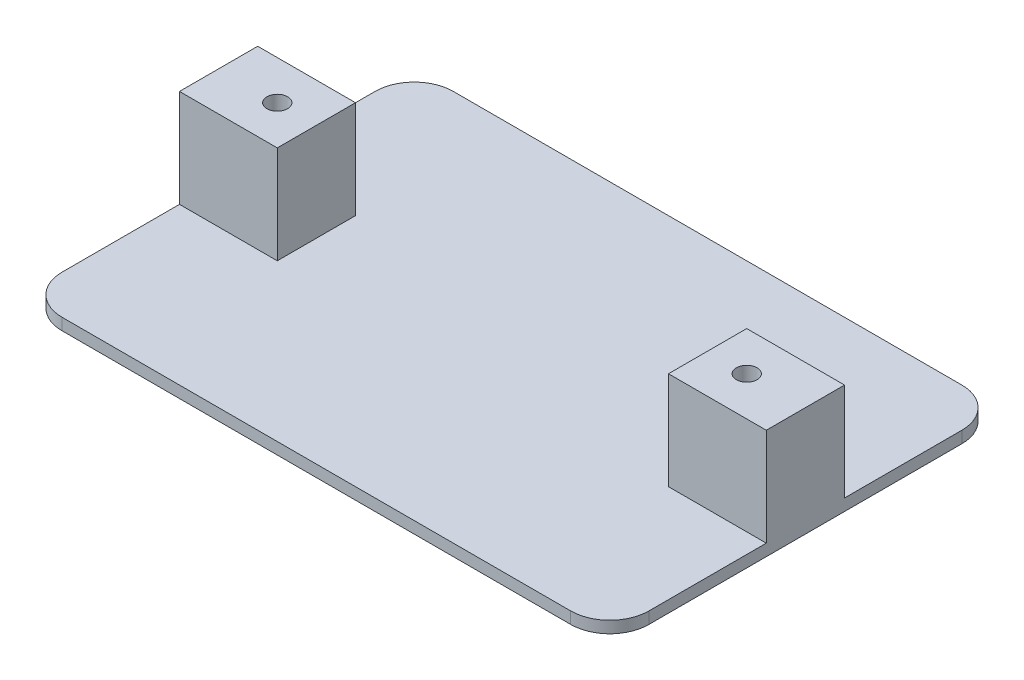
ISO-10303-21;
HEADER;
FILE_DESCRIPTION(('STEP AP214'),'2;1');
FILE_NAME('part.step','',(''),(''),'','','');
FILE_SCHEMA(('AUTOMOTIVE_DESIGN { 1 0 10303 214 1 1 1 1 }'));
ENDSEC;
DATA;
#1=APPLICATION_CONTEXT('core data for automotive mechanical design processes');
#2=APPLICATION_PROTOCOL_DEFINITION('international standard','automotive_design',2000,#1);
#3=PRODUCT_CONTEXT('',#1,'mechanical');
#4=PRODUCT('Part','Part','',(#3));
#5=PRODUCT_RELATED_PRODUCT_CATEGORY('part','',(#4));
#6=PRODUCT_DEFINITION_FORMATION('','',#4);
#7=PRODUCT_DEFINITION_CONTEXT('part definition',#1,'design');
#8=PRODUCT_DEFINITION('design','',#6,#7);
#9=PRODUCT_DEFINITION_SHAPE('','',#8);
#10=(LENGTH_UNIT() NAMED_UNIT(*) SI_UNIT(.MILLI.,.METRE.));
#11=(NAMED_UNIT(*) PLANE_ANGLE_UNIT() SI_UNIT($,.RADIAN.));
#12=(NAMED_UNIT(*) SI_UNIT($,.STERADIAN.) SOLID_ANGLE_UNIT());
#13=UNCERTAINTY_MEASURE_WITH_UNIT(LENGTH_MEASURE(1.E-05),#10,'distance_accuracy_value','');
#14=(GEOMETRIC_REPRESENTATION_CONTEXT(3) GLOBAL_UNCERTAINTY_ASSIGNED_CONTEXT((#13)) GLOBAL_UNIT_ASSIGNED_CONTEXT((#10,
#11,#12)) REPRESENTATION_CONTEXT('',''));
#15=CARTESIAN_POINT('',(0.,0.,0.));
#16=DIRECTION('',(0.,0.,1.));
#17=DIRECTION('',(1.,0.,0.));
#18=AXIS2_PLACEMENT_3D('',#15,#16,#17);
#19=CARTESIAN_POINT('',(0.,3.,0.));
#20=DIRECTION('',(0.,-1.,0.));
#21=DIRECTION('',(0.,0.,-1.));
#22=AXIS2_PLACEMENT_3D('',#19,#20,#21);
#23=PLANE('',#22);
#24=CARTESIAN_POINT('',(60.,3.,0.));
#25=DIRECTION('',(0.,1.,0.));
#26=DIRECTION('',(0.,0.,1.));
#27=AXIS2_PLACEMENT_3D('',#24,#25,#26);
#28=CIRCLE('',#27,2.6);
#29=CARTESIAN_POINT('',(60.,3.,2.6));
#30=VERTEX_POINT('',#29);
#31=EDGE_CURVE('E257',#30,#30,#28,.T.);
#32=ORIENTED_EDGE('',*,*,#31,.F.);
#33=EDGE_LOOP('',(#32));
#34=FACE_BOUND('',#33,.T.);
#35=CARTESIAN_POINT('',(60.,3.,0.));
#36=DIRECTION('',(0.,1.,0.));
#37=DIRECTION('',(0.,0.,1.));
#38=AXIS2_PLACEMENT_3D('',#35,#36,#37);
#39=CIRCLE('',#38,2.65);
#40=CARTESIAN_POINT('',(60.,3.,2.65000000000001));
#41=VERTEX_POINT('',#40);
#42=EDGE_CURVE('E624',#41,#41,#39,.T.);
#43=ORIENTED_EDGE('',*,*,#42,.T.);
#44=EDGE_LOOP('',(#43));
#45=FACE_BOUND('',#44,.T.);
#46=ADVANCED_FACE('F38',(#34,#45),#23,.F.);
#47=CARTESIAN_POINT('',(-60.,3.,0.));
#48=DIRECTION('',(0.,1.,0.));
#49=DIRECTION('',(0.,0.,1.));
#50=AXIS2_PLACEMENT_3D('',#47,#48,#49);
#51=CIRCLE('',#50,2.6);
#52=CARTESIAN_POINT('',(-60.,3.,2.6));
#53=VERTEX_POINT('',#52);
#54=EDGE_CURVE('E265',#53,#53,#51,.T.);
#55=ORIENTED_EDGE('',*,*,#54,.F.);
#56=EDGE_LOOP('',(#55));
#57=FACE_BOUND('',#56,.T.);
#58=CARTESIAN_POINT('',(-60.,3.,0.));
#59=DIRECTION('',(0.,1.,0.));
#60=DIRECTION('',(0.,0.,1.));
#61=AXIS2_PLACEMENT_3D('',#58,#59,#60);
#62=CIRCLE('',#61,2.65);
#63=CARTESIAN_POINT('',(-60.,3.,2.65));
#64=VERTEX_POINT('',#63);
#65=EDGE_CURVE('E175',#64,#64,#62,.T.);
#66=ORIENTED_EDGE('',*,*,#65,.T.);
#67=EDGE_LOOP('',(#66));
#68=FACE_BOUND('',#67,.T.);
#69=ADVANCED_FACE('F414',(#57,#68),#23,.F.);
#70=DIRECTION('',(-1.,0.,0.));
#71=VECTOR('',#70,1.);
#72=CARTESIAN_POINT('',(-75.,3.,-50.));
#73=LINE('',#72,#71);
#74=CARTESIAN_POINT('',(65.,3.,-50.));
#75=VERTEX_POINT('',#74);
#76=CARTESIAN_POINT('',(-65.,3.,-50.));
#77=VERTEX_POINT('',#76);
#78=EDGE_CURVE('E276',#75,#77,#73,.T.);
#79=ORIENTED_EDGE('',*,*,#78,.T.);
#80=CARTESIAN_POINT('',(-65.,3.,-40.));
#81=DIRECTION('',(0.,-1.,0.));
#82=DIRECTION('',(0.,0.,-1.));
#83=AXIS2_PLACEMENT_3D('',#80,#81,#82);
#84=CIRCLE('',#83,10.);
#85=CARTESIAN_POINT('',(-75.,3.,-40.));
#86=VERTEX_POINT('',#85);
#87=EDGE_CURVE('E336',#77,#86,#84,.F.);
#88=ORIENTED_EDGE('',*,*,#87,.T.);
#89=DIRECTION('',(0.,0.,1.));
#90=VECTOR('',#89,1.);
#91=CARTESIAN_POINT('',(-75.,3.,50.));
#92=LINE('',#91,#90);
#93=CARTESIAN_POINT('',(-75.,3.,-10.));
#94=VERTEX_POINT('',#93);
#95=EDGE_CURVE('E282',#86,#94,#92,.T.);
#96=ORIENTED_EDGE('',*,*,#95,.T.);
#97=DIRECTION('',(-1.,0.,0.));
#98=VECTOR('',#97,1.);
#99=CARTESIAN_POINT('',(-70.,3.,-10.));
#100=LINE('',#99,#98);
#101=CARTESIAN_POINT('',(-50.,3.,-10.));
#102=VERTEX_POINT('',#101);
#103=EDGE_CURVE('E234',#102,#94,#100,.T.);
#104=ORIENTED_EDGE('',*,*,#103,.F.);
#105=DIRECTION('',(0.,0.,-1.));
#106=VECTOR('',#105,1.);
#107=CARTESIAN_POINT('',(-50.,3.,10.));
#108=LINE('',#107,#106);
#109=CARTESIAN_POINT('',(-50.,3.,10.));
#110=VERTEX_POINT('',#109);
#111=EDGE_CURVE('E212',#110,#102,#108,.T.);
#112=ORIENTED_EDGE('',*,*,#111,.F.);
#113=DIRECTION('',(1.,0.,0.));
#114=VECTOR('',#113,1.);
#115=CARTESIAN_POINT('',(-70.,3.,10.));
#116=LINE('',#115,#114);
#117=CARTESIAN_POINT('',(-75.,3.,9.99999999999999));
#118=VERTEX_POINT('',#117);
#119=EDGE_CURVE('E221',#118,#110,#116,.T.);
#120=ORIENTED_EDGE('',*,*,#119,.F.);
#121=CARTESIAN_POINT('',(-75.,3.,40.));
#122=VERTEX_POINT('',#121);
#123=EDGE_CURVE('E281',#118,#122,#92,.T.);
#124=ORIENTED_EDGE('',*,*,#123,.T.);
#125=CARTESIAN_POINT('',(-65.,3.,40.));
#126=DIRECTION('',(0.,-1.,0.));
#127=DIRECTION('',(0.,0.,-1.));
#128=AXIS2_PLACEMENT_3D('',#125,#126,#127);
#129=CIRCLE('',#128,10.);
#130=CARTESIAN_POINT('',(-65.,3.,50.));
#131=VERTEX_POINT('',#130);
#132=EDGE_CURVE('E328',#122,#131,#129,.F.);
#133=ORIENTED_EDGE('',*,*,#132,.T.);
#134=DIRECTION('',(1.,0.,0.));
#135=VECTOR('',#134,1.);
#136=CARTESIAN_POINT('',(-75.,3.,50.));
#137=LINE('',#136,#135);
#138=CARTESIAN_POINT('',(65.,3.,50.));
#139=VERTEX_POINT('',#138);
#140=EDGE_CURVE('E285',#131,#139,#137,.T.);
#141=ORIENTED_EDGE('',*,*,#140,.T.);
#142=CARTESIAN_POINT('',(65.,3.,40.));
#143=DIRECTION('',(0.,-1.,0.));
#144=DIRECTION('',(0.,0.,-1.));
#145=AXIS2_PLACEMENT_3D('',#142,#143,#144);
#146=CIRCLE('',#145,10.);
#147=CARTESIAN_POINT('',(75.,3.,40.));
#148=VERTEX_POINT('',#147);
#149=EDGE_CURVE('E54',#139,#148,#146,.F.);
#150=ORIENTED_EDGE('',*,*,#149,.T.);
#151=DIRECTION('',(0.,0.,-1.));
#152=VECTOR('',#151,1.);
#153=CARTESIAN_POINT('',(75.,3.,50.));
#154=LINE('',#153,#152);
#155=CARTESIAN_POINT('',(75.,3.,10.0023947766886));
#156=VERTEX_POINT('',#155);
#157=EDGE_CURVE('E273',#148,#156,#154,.T.);
#158=ORIENTED_EDGE('',*,*,#157,.T.);
#159=DIRECTION('',(1.,0.,0.));
#160=VECTOR('',#159,1.);
#161=CARTESIAN_POINT('',(70.0023947766885,3.,10.0023947766886));
#162=LINE('',#161,#160);
#163=CARTESIAN_POINT('',(49.9976052233114,3.,10.0023947766885));
#164=VERTEX_POINT('',#163);
#165=EDGE_CURVE('E164',#164,#156,#162,.T.);
#166=ORIENTED_EDGE('',*,*,#165,.F.);
#167=DIRECTION('',(0.,0.,1.));
#168=VECTOR('',#167,1.);
#169=CARTESIAN_POINT('',(49.9976052233114,3.,10.0023947766886));
#170=LINE('',#169,#168);
#171=CARTESIAN_POINT('',(49.9976052233114,3.,-10.0023947766885));
#172=VERTEX_POINT('',#171);
#173=EDGE_CURVE('E193',#172,#164,#170,.T.);
#174=ORIENTED_EDGE('',*,*,#173,.F.);
#175=DIRECTION('',(-1.,0.,0.));
#176=VECTOR('',#175,1.);
#177=CARTESIAN_POINT('',(49.9976052233114,3.,-10.0023947766885));
#178=LINE('',#177,#176);
#179=CARTESIAN_POINT('',(75.,3.,-10.0023947766885));
#180=VERTEX_POINT('',#179);
#181=EDGE_CURVE('E171',#180,#172,#178,.T.);
#182=ORIENTED_EDGE('',*,*,#181,.F.);
#183=CARTESIAN_POINT('',(75.,3.,-40.));
#184=VERTEX_POINT('',#183);
#185=EDGE_CURVE('E277',#180,#184,#154,.T.);
#186=ORIENTED_EDGE('',*,*,#185,.T.);
#187=CARTESIAN_POINT('',(65.,3.,-40.));
#188=DIRECTION('',(0.,-1.,0.));
#189=DIRECTION('',(0.,0.,-1.));
#190=AXIS2_PLACEMENT_3D('',#187,#188,#189);
#191=CIRCLE('',#190,10.);
#192=EDGE_CURVE('E333',#184,#75,#191,.F.);
#193=ORIENTED_EDGE('',*,*,#192,.T.);
#194=EDGE_LOOP('',(#79,#88,#96,#104,#112,#120,#124,#133,#141,#150,#158,#166,#174,#182,#186,#193));
#195=FACE_BOUND('',#194,.T.);
#196=ADVANCED_FACE('F364',(#195),#23,.F.);
#197=CARTESIAN_POINT('',(0.,0.,0.));
#198=DIRECTION('',(0.,-1.,0.));
#199=DIRECTION('',(0.,0.,-1.));
#200=AXIS2_PLACEMENT_3D('',#197,#198,#199);
#201=PLANE('',#200);
#202=CARTESIAN_POINT('',(-60.,0.,0.));
#203=DIRECTION('',(0.,1.,0.));
#204=DIRECTION('',(0.,0.,1.));
#205=AXIS2_PLACEMENT_3D('',#202,#203,#204);
#206=CIRCLE('',#205,2.6);
#207=CARTESIAN_POINT('',(-60.,0.,2.6));
#208=VERTEX_POINT('',#207);
#209=EDGE_CURVE('E261',#208,#208,#206,.T.);
#210=ORIENTED_EDGE('',*,*,#209,.T.);
#211=EDGE_LOOP('',(#210));
#212=FACE_BOUND('',#211,.T.);
#213=DIRECTION('',(0.,0.,1.));
#214=VECTOR('',#213,1.);
#215=CARTESIAN_POINT('',(-75.,0.,50.));
#216=LINE('',#215,#214);
#217=CARTESIAN_POINT('',(-75.,0.,-40.));
#218=VERTEX_POINT('',#217);
#219=CARTESIAN_POINT('',(-75.,0.,40.));
#220=VERTEX_POINT('',#219);
#221=EDGE_CURVE('E296',#218,#220,#216,.T.);
#222=ORIENTED_EDGE('',*,*,#221,.F.);
#223=CARTESIAN_POINT('',(-65.,0.,-40.));
#224=DIRECTION('',(0.,-1.,0.));
#225=DIRECTION('',(0.,0.,-1.));
#226=AXIS2_PLACEMENT_3D('',#223,#224,#225);
#227=CIRCLE('',#226,10.);
#228=CARTESIAN_POINT('',(-65.,0.,-50.));
#229=VERTEX_POINT('',#228);
#230=EDGE_CURVE('E318',#218,#229,#227,.T.);
#231=ORIENTED_EDGE('',*,*,#230,.T.);
#232=DIRECTION('',(-1.,0.,0.));
#233=VECTOR('',#232,1.);
#234=CARTESIAN_POINT('',(-75.,0.,-50.));
#235=LINE('',#234,#233);
#236=CARTESIAN_POINT('',(65.,0.,-50.));
#237=VERTEX_POINT('',#236);
#238=EDGE_CURVE('E292',#237,#229,#235,.T.);
#239=ORIENTED_EDGE('',*,*,#238,.F.);
#240=CARTESIAN_POINT('',(65.,0.,-40.));
#241=DIRECTION('',(0.,-1.,0.));
#242=DIRECTION('',(0.,0.,-1.));
#243=AXIS2_PLACEMENT_3D('',#240,#241,#242);
#244=CIRCLE('',#243,10.);
#245=CARTESIAN_POINT('',(75.,0.,-40.));
#246=VERTEX_POINT('',#245);
#247=EDGE_CURVE('E315',#237,#246,#244,.T.);
#248=ORIENTED_EDGE('',*,*,#247,.T.);
#249=DIRECTION('',(0.,0.,-1.));
#250=VECTOR('',#249,1.);
#251=CARTESIAN_POINT('',(75.,0.,50.));
#252=LINE('',#251,#250);
#253=CARTESIAN_POINT('',(75.,0.,40.));
#254=VERTEX_POINT('',#253);
#255=EDGE_CURVE('E269',#254,#246,#252,.T.);
#256=ORIENTED_EDGE('',*,*,#255,.F.);
#257=CARTESIAN_POINT('',(65.,0.,40.));
#258=DIRECTION('',(0.,-1.,0.));
#259=DIRECTION('',(0.,0.,-1.));
#260=AXIS2_PLACEMENT_3D('',#257,#258,#259);
#261=CIRCLE('',#260,10.);
#262=CARTESIAN_POINT('',(65.,0.,50.));
#263=VERTEX_POINT('',#262);
#264=EDGE_CURVE('E312',#254,#263,#261,.T.);
#265=ORIENTED_EDGE('',*,*,#264,.T.);
#266=DIRECTION('',(1.,0.,0.));
#267=VECTOR('',#266,1.);
#268=CARTESIAN_POINT('',(-75.,0.,50.));
#269=LINE('',#268,#267);
#270=CARTESIAN_POINT('',(-65.,0.,50.));
#271=VERTEX_POINT('',#270);
#272=EDGE_CURVE('E300',#271,#263,#269,.T.);
#273=ORIENTED_EDGE('',*,*,#272,.F.);
#274=CARTESIAN_POINT('',(-65.,0.,40.));
#275=DIRECTION('',(0.,-1.,0.));
#276=DIRECTION('',(0.,0.,-1.));
#277=AXIS2_PLACEMENT_3D('',#274,#275,#276);
#278=CIRCLE('',#277,10.);
#279=EDGE_CURVE('E309',#271,#220,#278,.T.);
#280=ORIENTED_EDGE('',*,*,#279,.T.);
#281=EDGE_LOOP('',(#222,#231,#239,#248,#256,#265,#273,#280));
#282=FACE_BOUND('',#281,.T.);
#283=CARTESIAN_POINT('',(60.,0.,0.));
#284=DIRECTION('',(0.,1.,0.));
#285=DIRECTION('',(0.,0.,1.));
#286=AXIS2_PLACEMENT_3D('',#283,#284,#285);
#287=CIRCLE('',#286,2.6);
#288=CARTESIAN_POINT('',(60.,0.,2.6));
#289=VERTEX_POINT('',#288);
#290=EDGE_CURVE('E256',#289,#289,#287,.T.);
#291=ORIENTED_EDGE('',*,*,#290,.T.);
#292=EDGE_LOOP('',(#291));
#293=FACE_BOUND('',#292,.T.);
#294=ADVANCED_FACE('F354',(#212,#282,#293),#201,.T.);
#295=CARTESIAN_POINT('',(75.,3.,50.));
#296=DIRECTION('',(-1.,0.,0.));
#297=DIRECTION('',(0.,0.,1.));
#298=AXIS2_PLACEMENT_3D('',#295,#296,#297);
#299=PLANE('',#298);
#300=ORIENTED_EDGE('',*,*,#255,.T.);
#301=DIRECTION('',(0.,-1.,0.));
#302=VECTOR('',#301,1.);
#303=CARTESIAN_POINT('',(75.,3.,-40.));
#304=LINE('',#303,#302);
#305=EDGE_CURVE('E343',#246,#184,#304,.F.);
#306=ORIENTED_EDGE('',*,*,#305,.T.);
#307=ORIENTED_EDGE('',*,*,#185,.F.);
#308=DIRECTION('',(0.,-1.,0.));
#309=VECTOR('',#308,1.);
#310=CARTESIAN_POINT('',(75.,28.,-10.0023947766885));
#311=LINE('',#310,#309);
#312=CARTESIAN_POINT('',(75.,28.,-10.0023947766885));
#313=VERTEX_POINT('',#312);
#314=EDGE_CURVE('E190',#313,#180,#311,.T.);
#315=ORIENTED_EDGE('',*,*,#314,.F.);
#316=DIRECTION('',(0.,0.,-1.));
#317=VECTOR('',#316,1.);
#318=CARTESIAN_POINT('',(75.,28.,-10.0023947766885));
#319=LINE('',#318,#317);
#320=CARTESIAN_POINT('',(75.,28.,10.0023947766886));
#321=VERTEX_POINT('',#320);
#322=EDGE_CURVE('E159',#321,#313,#319,.T.);
#323=ORIENTED_EDGE('',*,*,#322,.F.);
#324=DIRECTION('',(0.,-1.,0.));
#325=VECTOR('',#324,1.);
#326=CARTESIAN_POINT('',(75.,28.,10.0023947766886));
#327=LINE('',#326,#325);
#328=EDGE_CURVE('E202',#321,#156,#327,.T.);
#329=ORIENTED_EDGE('',*,*,#328,.T.);
#330=ORIENTED_EDGE('',*,*,#157,.F.);
#331=DIRECTION('',(0.,-1.,0.));
#332=VECTOR('',#331,1.);
#333=CARTESIAN_POINT('',(75.,3.,40.));
#334=LINE('',#333,#332);
#335=EDGE_CURVE('E339',#148,#254,#334,.T.);
#336=ORIENTED_EDGE('',*,*,#335,.T.);
#337=EDGE_LOOP('',(#300,#306,#307,#315,#323,#329,#330,#336));
#338=FACE_BOUND('',#337,.T.);
#339=ADVANCED_FACE('F361',(#338),#299,.F.);
#340=CARTESIAN_POINT('',(-75.,3.,-50.));
#341=DIRECTION('',(0.,0.,1.));
#342=DIRECTION('',(1.,0.,0.));
#343=AXIS2_PLACEMENT_3D('',#340,#341,#342);
#344=PLANE('',#343);
#345=ORIENTED_EDGE('',*,*,#238,.T.);
#346=DIRECTION('',(0.,-1.,0.));
#347=VECTOR('',#346,1.);
#348=CARTESIAN_POINT('',(-65.,3.,-50.));
#349=LINE('',#348,#347);
#350=EDGE_CURVE('E325',#229,#77,#349,.F.);
#351=ORIENTED_EDGE('',*,*,#350,.T.);
#352=ORIENTED_EDGE('',*,*,#78,.F.);
#353=DIRECTION('',(0.,-1.,0.));
#354=VECTOR('',#353,1.);
#355=CARTESIAN_POINT('',(65.,3.,-50.));
#356=LINE('',#355,#354);
#357=EDGE_CURVE('E321',#75,#237,#356,.T.);
#358=ORIENTED_EDGE('',*,*,#357,.T.);
#359=EDGE_LOOP('',(#345,#351,#352,#358));
#360=FACE_BOUND('',#359,.T.);
#361=ADVANCED_FACE('F383',(#360),#344,.F.);
#362=CARTESIAN_POINT('',(-75.,3.,50.));
#363=DIRECTION('',(1.,0.,0.));
#364=DIRECTION('',(0.,0.,-1.));
#365=AXIS2_PLACEMENT_3D('',#362,#363,#364);
#366=PLANE('',#365);
#367=ORIENTED_EDGE('',*,*,#95,.F.);
#368=DIRECTION('',(0.,-1.,0.));
#369=VECTOR('',#368,1.);
#370=CARTESIAN_POINT('',(-75.,3.,-40.));
#371=LINE('',#370,#369);
#372=EDGE_CURVE('E305',#86,#218,#371,.T.);
#373=ORIENTED_EDGE('',*,*,#372,.T.);
#374=ORIENTED_EDGE('',*,*,#221,.T.);
#375=DIRECTION('',(0.,-1.,0.));
#376=VECTOR('',#375,1.);
#377=CARTESIAN_POINT('',(-75.,3.,40.));
#378=LINE('',#377,#376);
#379=EDGE_CURVE('E288',#220,#122,#378,.F.);
#380=ORIENTED_EDGE('',*,*,#379,.T.);
#381=ORIENTED_EDGE('',*,*,#123,.F.);
#382=DIRECTION('',(0.,-1.,0.));
#383=VECTOR('',#382,1.);
#384=CARTESIAN_POINT('',(-75.,28.,10.));
#385=LINE('',#384,#383);
#386=CARTESIAN_POINT('',(-75.,28.,10.));
#387=VERTEX_POINT('',#386);
#388=EDGE_CURVE('E244',#387,#118,#385,.T.);
#389=ORIENTED_EDGE('',*,*,#388,.F.);
#390=DIRECTION('',(0.,0.,1.));
#391=VECTOR('',#390,1.);
#392=CARTESIAN_POINT('',(-75.,28.,-10.));
#393=LINE('',#392,#391);
#394=CARTESIAN_POINT('',(-75.,28.,-10.));
#395=VERTEX_POINT('',#394);
#396=EDGE_CURVE('E224',#395,#387,#393,.T.);
#397=ORIENTED_EDGE('',*,*,#396,.F.);
#398=DIRECTION('',(0.,-1.,0.));
#399=VECTOR('',#398,1.);
#400=CARTESIAN_POINT('',(-75.,28.,-10.));
#401=LINE('',#400,#399);
#402=EDGE_CURVE('E248',#395,#94,#401,.T.);
#403=ORIENTED_EDGE('',*,*,#402,.T.);
#404=EDGE_LOOP('',(#367,#373,#374,#380,#381,#389,#397,#403));
#405=FACE_BOUND('',#404,.T.);
#406=ADVANCED_FACE('F377',(#405),#366,.F.);
#407=CARTESIAN_POINT('',(-75.,3.,50.));
#408=DIRECTION('',(0.,0.,-1.));
#409=DIRECTION('',(-1.,0.,0.));
#410=AXIS2_PLACEMENT_3D('',#407,#408,#409);
#411=PLANE('',#410);
#412=ORIENTED_EDGE('',*,*,#272,.T.);
#413=DIRECTION('',(0.,-1.,0.));
#414=VECTOR('',#413,1.);
#415=CARTESIAN_POINT('',(65.,3.,50.));
#416=LINE('',#415,#414);
#417=EDGE_CURVE('E11',#263,#139,#416,.F.);
#418=ORIENTED_EDGE('',*,*,#417,.T.);
#419=ORIENTED_EDGE('',*,*,#140,.F.);
#420=DIRECTION('',(0.,-1.,0.));
#421=VECTOR('',#420,1.);
#422=CARTESIAN_POINT('',(-65.,3.,50.));
#423=LINE('',#422,#421);
#424=EDGE_CURVE('E47',#131,#271,#423,.T.);
#425=ORIENTED_EDGE('',*,*,#424,.T.);
#426=EDGE_LOOP('',(#412,#418,#419,#425));
#427=FACE_BOUND('',#426,.T.);
#428=ADVANCED_FACE('F349',(#427),#411,.F.);
#429=CARTESIAN_POINT('',(-60.,3.,0.));
#430=DIRECTION('',(0.,-1.,0.));
#431=DIRECTION('',(0.,0.,-1.));
#432=AXIS2_PLACEMENT_3D('',#429,#430,#431);
#433=CYLINDRICAL_SURFACE('',#432,2.6);
#434=ORIENTED_EDGE('',*,*,#54,.T.);
#435=EDGE_LOOP('',(#434));
#436=FACE_BOUND('',#435,.T.);
#437=ORIENTED_EDGE('',*,*,#209,.F.);
#438=EDGE_LOOP('',(#437));
#439=FACE_BOUND('',#438,.T.);
#440=ADVANCED_FACE('F426',(#436,#439),#433,.F.);
#441=CARTESIAN_POINT('',(60.,3.,0.));
#442=DIRECTION('',(0.,-1.,0.));
#443=DIRECTION('',(0.,0.,-1.));
#444=AXIS2_PLACEMENT_3D('',#441,#442,#443);
#445=CYLINDRICAL_SURFACE('',#444,2.6);
#446=ORIENTED_EDGE('',*,*,#31,.T.);
#447=EDGE_LOOP('',(#446));
#448=FACE_BOUND('',#447,.T.);
#449=ORIENTED_EDGE('',*,*,#290,.F.);
#450=EDGE_LOOP('',(#449));
#451=FACE_BOUND('',#450,.T.);
#452=ADVANCED_FACE('F404',(#448,#451),#445,.F.);
#453=CARTESIAN_POINT('',(0.,28.,0.));
#454=DIRECTION('',(0.,-1.,0.));
#455=DIRECTION('',(0.,0.,-1.));
#456=AXIS2_PLACEMENT_3D('',#453,#454,#455);
#457=PLANE('',#456);
#458=DIRECTION('',(0.,0.,-1.));
#459=VECTOR('',#458,1.);
#460=CARTESIAN_POINT('',(-50.,28.,10.));
#461=LINE('',#460,#459);
#462=CARTESIAN_POINT('',(-50.,28.,10.));
#463=VERTEX_POINT('',#462);
#464=CARTESIAN_POINT('',(-50.,28.,-10.));
#465=VERTEX_POINT('',#464);
#466=EDGE_CURVE('E216',#463,#465,#461,.T.);
#467=ORIENTED_EDGE('',*,*,#466,.T.);
#468=DIRECTION('',(-1.,0.,0.));
#469=VECTOR('',#468,1.);
#470=CARTESIAN_POINT('',(-70.,28.,-10.));
#471=LINE('',#470,#469);
#472=EDGE_CURVE('E220',#465,#395,#471,.T.);
#473=ORIENTED_EDGE('',*,*,#472,.T.);
#474=ORIENTED_EDGE('',*,*,#396,.T.);
#475=DIRECTION('',(1.,0.,0.));
#476=VECTOR('',#475,1.);
#477=CARTESIAN_POINT('',(-70.,28.,10.));
#478=LINE('',#477,#476);
#479=EDGE_CURVE('E227',#387,#463,#478,.T.);
#480=ORIENTED_EDGE('',*,*,#479,.T.);
#481=EDGE_LOOP('',(#467,#473,#474,#480));
#482=FACE_BOUND('',#481,.T.);
#483=CARTESIAN_POINT('',(-60.,28.,0.));
#484=DIRECTION('',(0.,1.,0.));
#485=DIRECTION('',(0.,0.,1.));
#486=AXIS2_PLACEMENT_3D('',#483,#484,#485);
#487=CIRCLE('',#486,2.65);
#488=CARTESIAN_POINT('',(-60.,28.,2.65));
#489=VERTEX_POINT('',#488);
#490=EDGE_CURVE('E208',#489,#489,#487,.T.);
#491=ORIENTED_EDGE('',*,*,#490,.F.);
#492=EDGE_LOOP('',(#491));
#493=FACE_BOUND('',#492,.T.);
#494=ADVANCED_FACE('F401',(#482,#493),#457,.F.);
#495=CARTESIAN_POINT('',(-50.,28.,10.));
#496=DIRECTION('',(-1.,0.,0.));
#497=DIRECTION('',(0.,0.,1.));
#498=AXIS2_PLACEMENT_3D('',#495,#496,#497);
#499=PLANE('',#498);
#500=ORIENTED_EDGE('',*,*,#111,.T.);
#501=DIRECTION('',(0.,-1.,0.));
#502=VECTOR('',#501,1.);
#503=CARTESIAN_POINT('',(-50.,28.,-10.));
#504=LINE('',#503,#502);
#505=EDGE_CURVE('E252',#465,#102,#504,.T.);
#506=ORIENTED_EDGE('',*,*,#505,.F.);
#507=ORIENTED_EDGE('',*,*,#466,.F.);
#508=DIRECTION('',(0.,-1.,0.));
#509=VECTOR('',#508,1.);
#510=CARTESIAN_POINT('',(-50.,28.,10.));
#511=LINE('',#510,#509);
#512=EDGE_CURVE('E230',#463,#110,#511,.T.);
#513=ORIENTED_EDGE('',*,*,#512,.T.);
#514=EDGE_LOOP('',(#500,#506,#507,#513));
#515=FACE_BOUND('',#514,.T.);
#516=ADVANCED_FACE('F399',(#515),#499,.F.);
#517=CARTESIAN_POINT('',(-70.,28.,-10.));
#518=DIRECTION('',(0.,0.,1.));
#519=DIRECTION('',(1.,0.,0.));
#520=AXIS2_PLACEMENT_3D('',#517,#518,#519);
#521=PLANE('',#520);
#522=ORIENTED_EDGE('',*,*,#103,.T.);
#523=ORIENTED_EDGE('',*,*,#402,.F.);
#524=ORIENTED_EDGE('',*,*,#472,.F.);
#525=ORIENTED_EDGE('',*,*,#505,.T.);
#526=EDGE_LOOP('',(#522,#523,#524,#525));
#527=FACE_BOUND('',#526,.T.);
#528=ADVANCED_FACE('F391',(#527),#521,.F.);
#529=CARTESIAN_POINT('',(-70.,28.,10.));
#530=DIRECTION('',(0.,0.,-1.));
#531=DIRECTION('',(-1.,0.,0.));
#532=AXIS2_PLACEMENT_3D('',#529,#530,#531);
#533=PLANE('',#532);
#534=ORIENTED_EDGE('',*,*,#119,.T.);
#535=ORIENTED_EDGE('',*,*,#512,.F.);
#536=ORIENTED_EDGE('',*,*,#479,.F.);
#537=ORIENTED_EDGE('',*,*,#388,.T.);
#538=EDGE_LOOP('',(#534,#535,#536,#537));
#539=FACE_BOUND('',#538,.T.);
#540=ADVANCED_FACE('F396',(#539),#533,.F.);
#541=CARTESIAN_POINT('',(-60.,28.,0.));
#542=DIRECTION('',(0.,-1.,0.));
#543=DIRECTION('',(0.,0.,-1.));
#544=AXIS2_PLACEMENT_3D('',#541,#542,#543);
#545=CYLINDRICAL_SURFACE('',#544,2.65);
#546=ORIENTED_EDGE('',*,*,#490,.T.);
#547=EDGE_LOOP('',(#546));
#548=FACE_BOUND('',#547,.T.);
#549=ORIENTED_EDGE('',*,*,#65,.F.);
#550=EDGE_LOOP('',(#549));
#551=FACE_BOUND('',#550,.T.);
#552=ADVANCED_FACE('F408',(#548,#551),#545,.F.);
#553=CARTESIAN_POINT('',(0.,28.,0.));
#554=DIRECTION('',(0.,-1.,0.));
#555=DIRECTION('',(0.,0.,-1.));
#556=AXIS2_PLACEMENT_3D('',#553,#554,#555);
#557=PLANE('',#556);
#558=DIRECTION('',(-1.,0.,0.));
#559=VECTOR('',#558,1.);
#560=CARTESIAN_POINT('',(70.0023947766885,28.,-10.0023947766885));
#561=LINE('',#560,#559);
#562=CARTESIAN_POINT('',(49.9976052233114,28.,-10.0023947766885));
#563=VERTEX_POINT('',#562);
#564=EDGE_CURVE('E151',#313,#563,#561,.T.);
#565=ORIENTED_EDGE('',*,*,#564,.T.);
#566=DIRECTION('',(0.,0.,1.));
#567=VECTOR('',#566,1.);
#568=CARTESIAN_POINT('',(49.9976052233114,28.,10.0023947766886));
#569=LINE('',#568,#567);
#570=CARTESIAN_POINT('',(49.9976052233114,28.,10.0023947766886));
#571=VERTEX_POINT('',#570);
#572=EDGE_CURVE('E156',#563,#571,#569,.T.);
#573=ORIENTED_EDGE('',*,*,#572,.T.);
#574=DIRECTION('',(1.,0.,0.));
#575=VECTOR('',#574,1.);
#576=CARTESIAN_POINT('',(49.9976052233114,28.,10.0023947766886));
#577=LINE('',#576,#575);
#578=EDGE_CURVE('E182',#571,#321,#577,.T.);
#579=ORIENTED_EDGE('',*,*,#578,.T.);
#580=ORIENTED_EDGE('',*,*,#322,.T.);
#581=EDGE_LOOP('',(#565,#573,#579,#580));
#582=FACE_BOUND('',#581,.T.);
#583=CARTESIAN_POINT('',(60.,28.,0.));
#584=DIRECTION('',(0.,1.,0.));
#585=DIRECTION('',(0.,0.,1.));
#586=AXIS2_PLACEMENT_3D('',#583,#584,#585);
#587=CIRCLE('',#586,2.65);
#588=CARTESIAN_POINT('',(60.,28.,2.65000000000001));
#589=VERTEX_POINT('',#588);
#590=EDGE_CURVE('E194',#589,#589,#587,.T.);
#591=ORIENTED_EDGE('',*,*,#590,.F.);
#592=EDGE_LOOP('',(#591));
#593=FACE_BOUND('',#592,.T.);
#594=ADVANCED_FACE('F153',(#582,#593),#557,.F.);
#595=CARTESIAN_POINT('',(49.9976052233114,28.,-10.0023947766885));
#596=DIRECTION('',(0.,0.,1.));
#597=DIRECTION('',(1.,0.,0.));
#598=AXIS2_PLACEMENT_3D('',#595,#596,#597);
#599=PLANE('',#598);
#600=ORIENTED_EDGE('',*,*,#181,.T.);
#601=DIRECTION('',(0.,-1.,0.));
#602=VECTOR('',#601,1.);
#603=CARTESIAN_POINT('',(49.9976052233114,28.,-10.0023947766885));
#604=LINE('',#603,#602);
#605=EDGE_CURVE('E168',#563,#172,#604,.T.);
#606=ORIENTED_EDGE('',*,*,#605,.F.);
#607=ORIENTED_EDGE('',*,*,#564,.F.);
#608=ORIENTED_EDGE('',*,*,#314,.T.);
#609=EDGE_LOOP('',(#600,#606,#607,#608));
#610=FACE_BOUND('',#609,.T.);
#611=ADVANCED_FACE('F169',(#610),#599,.F.);
#612=CARTESIAN_POINT('',(49.9976052233114,28.,10.0023947766886));
#613=DIRECTION('',(1.,0.,0.));
#614=DIRECTION('',(0.,0.,-1.));
#615=AXIS2_PLACEMENT_3D('',#612,#613,#614);
#616=PLANE('',#615);
#617=ORIENTED_EDGE('',*,*,#173,.T.);
#618=DIRECTION('',(0.,-1.,0.));
#619=VECTOR('',#618,1.);
#620=CARTESIAN_POINT('',(49.9976052233114,28.,10.0023947766886));
#621=LINE('',#620,#619);
#622=EDGE_CURVE('E176',#571,#164,#621,.T.);
#623=ORIENTED_EDGE('',*,*,#622,.F.);
#624=ORIENTED_EDGE('',*,*,#572,.F.);
#625=ORIENTED_EDGE('',*,*,#605,.T.);
#626=EDGE_LOOP('',(#617,#623,#624,#625));
#627=FACE_BOUND('',#626,.T.);
#628=ADVANCED_FACE('F178',(#627),#616,.F.);
#629=CARTESIAN_POINT('',(70.0023947766885,28.,10.0023947766886));
#630=DIRECTION('',(0.,0.,-1.));
#631=DIRECTION('',(-1.,0.,0.));
#632=AXIS2_PLACEMENT_3D('',#629,#630,#631);
#633=PLANE('',#632);
#634=ORIENTED_EDGE('',*,*,#165,.T.);
#635=ORIENTED_EDGE('',*,*,#328,.F.);
#636=ORIENTED_EDGE('',*,*,#578,.F.);
#637=ORIENTED_EDGE('',*,*,#622,.T.);
#638=EDGE_LOOP('',(#634,#635,#636,#637));
#639=FACE_BOUND('',#638,.T.);
#640=ADVANCED_FACE('F366',(#639),#633,.F.);
#641=CARTESIAN_POINT('',(60.,28.,0.));
#642=DIRECTION('',(0.,-1.,0.));
#643=DIRECTION('',(0.,0.,-1.));
#644=AXIS2_PLACEMENT_3D('',#641,#642,#643);
#645=CYLINDRICAL_SURFACE('',#644,2.65);
#646=ORIENTED_EDGE('',*,*,#590,.T.);
#647=EDGE_LOOP('',(#646));
#648=FACE_BOUND('',#647,.T.);
#649=ORIENTED_EDGE('',*,*,#42,.F.);
#650=EDGE_LOOP('',(#649));
#651=FACE_BOUND('',#650,.T.);
#652=ADVANCED_FACE('F442',(#648,#651),#645,.F.);
#653=CARTESIAN_POINT('',(-65.,3.,-40.));
#654=DIRECTION('',(0.,-1.,0.));
#655=DIRECTION('',(0.,0.,-1.));
#656=AXIS2_PLACEMENT_3D('',#653,#654,#655);
#657=CYLINDRICAL_SURFACE('',#656,10.);
#658=ORIENTED_EDGE('',*,*,#87,.F.);
#659=ORIENTED_EDGE('',*,*,#350,.F.);
#660=ORIENTED_EDGE('',*,*,#230,.F.);
#661=ORIENTED_EDGE('',*,*,#372,.F.);
#662=EDGE_LOOP('',(#658,#659,#660,#661));
#663=FACE_BOUND('',#662,.T.);
#664=ADVANCED_FACE('F387',(#663),#657,.T.);
#665=CARTESIAN_POINT('',(65.,3.,-40.));
#666=DIRECTION('',(0.,-1.,0.));
#667=DIRECTION('',(0.,0.,-1.));
#668=AXIS2_PLACEMENT_3D('',#665,#666,#667);
#669=CYLINDRICAL_SURFACE('',#668,10.);
#670=ORIENTED_EDGE('',*,*,#192,.F.);
#671=ORIENTED_EDGE('',*,*,#305,.F.);
#672=ORIENTED_EDGE('',*,*,#247,.F.);
#673=ORIENTED_EDGE('',*,*,#357,.F.);
#674=EDGE_LOOP('',(#670,#671,#672,#673));
#675=FACE_BOUND('',#674,.T.);
#676=ADVANCED_FACE('F441',(#675),#669,.T.);
#677=CARTESIAN_POINT('',(65.,3.,40.));
#678=DIRECTION('',(0.,-1.,0.));
#679=DIRECTION('',(0.,0.,-1.));
#680=AXIS2_PLACEMENT_3D('',#677,#678,#679);
#681=CYLINDRICAL_SURFACE('',#680,10.);
#682=ORIENTED_EDGE('',*,*,#149,.F.);
#683=ORIENTED_EDGE('',*,*,#417,.F.);
#684=ORIENTED_EDGE('',*,*,#264,.F.);
#685=ORIENTED_EDGE('',*,*,#335,.F.);
#686=EDGE_LOOP('',(#682,#683,#684,#685));
#687=FACE_BOUND('',#686,.T.);
#688=ADVANCED_FACE('F359',(#687),#681,.T.);
#689=CARTESIAN_POINT('',(-65.,3.,40.));
#690=DIRECTION('',(0.,-1.,0.));
#691=DIRECTION('',(0.,0.,-1.));
#692=AXIS2_PLACEMENT_3D('',#689,#690,#691);
#693=CYLINDRICAL_SURFACE('',#692,10.);
#694=ORIENTED_EDGE('',*,*,#132,.F.);
#695=ORIENTED_EDGE('',*,*,#379,.F.);
#696=ORIENTED_EDGE('',*,*,#279,.F.);
#697=ORIENTED_EDGE('',*,*,#424,.F.);
#698=EDGE_LOOP('',(#694,#695,#696,#697));
#699=FACE_BOUND('',#698,.T.);
#700=ADVANCED_FACE('F40',(#699),#693,.T.);
#701=CLOSED_SHELL('',(#46,#69,#196,#294,#339,#361,#406,#428,#440,#452,#494,#516,#528,#540,#552,
#594,#611,#628,#640,#652,#664,#676,#688,#700));
#702=MANIFOLD_SOLID_BREP('B2',#701);
#703=ADVANCED_BREP_SHAPE_REPRESENTATION('',(#18,#702),#14);
#704=SHAPE_DEFINITION_REPRESENTATION(#9,#703);
ENDSEC;
END-ISO-10303-21;
